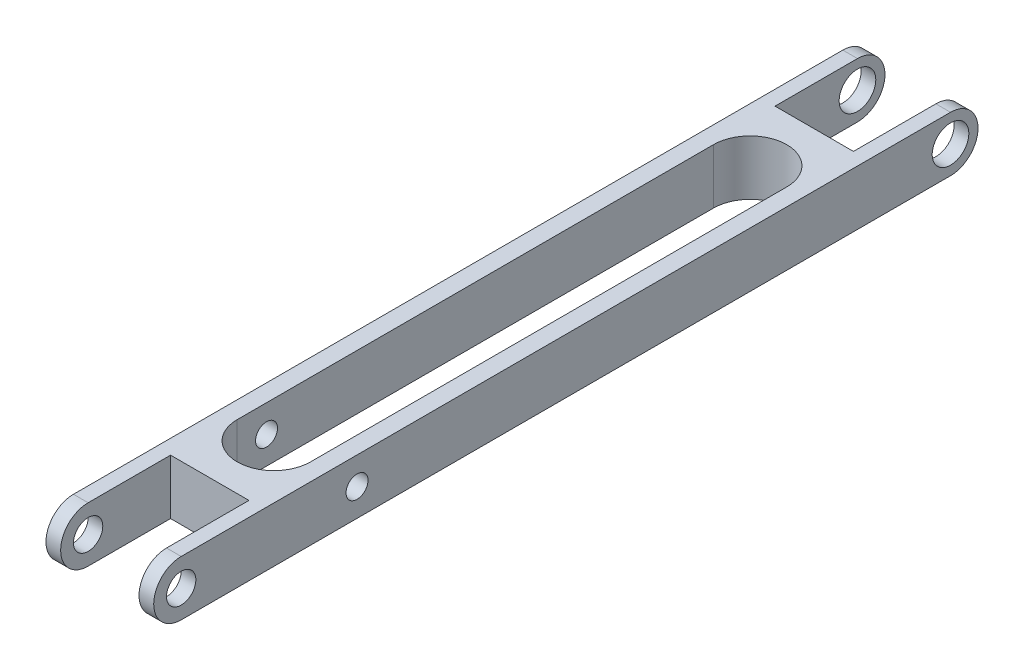
ISO-10303-21;
HEADER;
FILE_DESCRIPTION(('STEP AP214'),'2;1');
FILE_NAME('part.step','',(''),(''),'','','');
FILE_SCHEMA(('AUTOMOTIVE_DESIGN { 1 0 10303 214 1 1 1 1 }'));
ENDSEC;
DATA;
#1=APPLICATION_CONTEXT('core data for automotive mechanical design processes');
#2=APPLICATION_PROTOCOL_DEFINITION('international standard','automotive_design',2000,#1);
#3=PRODUCT_CONTEXT('',#1,'mechanical');
#4=PRODUCT('Part','Part','',(#3));
#5=PRODUCT_RELATED_PRODUCT_CATEGORY('part','',(#4));
#6=PRODUCT_DEFINITION_FORMATION('','',#4);
#7=PRODUCT_DEFINITION_CONTEXT('part definition',#1,'design');
#8=PRODUCT_DEFINITION('design','',#6,#7);
#9=PRODUCT_DEFINITION_SHAPE('','',#8);
#10=(LENGTH_UNIT() NAMED_UNIT(*) SI_UNIT(.MILLI.,.METRE.));
#11=(NAMED_UNIT(*) PLANE_ANGLE_UNIT() SI_UNIT($,.RADIAN.));
#12=(NAMED_UNIT(*) SI_UNIT($,.STERADIAN.) SOLID_ANGLE_UNIT());
#13=UNCERTAINTY_MEASURE_WITH_UNIT(LENGTH_MEASURE(1.E-05),#10,'distance_accuracy_value','');
#14=(GEOMETRIC_REPRESENTATION_CONTEXT(3) GLOBAL_UNCERTAINTY_ASSIGNED_CONTEXT((#13)) GLOBAL_UNIT_ASSIGNED_CONTEXT((#10,
#11,#12)) REPRESENTATION_CONTEXT('',''));
#15=CARTESIAN_POINT('',(0.,0.,0.));
#16=DIRECTION('',(0.,0.,1.));
#17=DIRECTION('',(1.,0.,0.));
#18=AXIS2_PLACEMENT_3D('',#15,#16,#17);
#19=CARTESIAN_POINT('',(29.4,0.,-105.));
#20=DIRECTION('',(-1.,0.,0.));
#21=DIRECTION('',(0.,0.,1.));
#22=AXIS2_PLACEMENT_3D('',#19,#20,#21);
#23=CYLINDRICAL_SURFACE('',#22,7.5);
#24=DIRECTION('',(-1.,0.,0.));
#25=VECTOR('',#24,1.);
#26=CARTESIAN_POINT('',(29.4,7.5,-105.));
#27=LINE('',#26,#25);
#28=CARTESIAN_POINT('',(4.,7.5,-105.));
#29=VERTEX_POINT('',#28);
#30=CARTESIAN_POINT('',(0.,7.5,-105.));
#31=VERTEX_POINT('',#30);
#32=EDGE_CURVE('E340',#29,#31,#27,.T.);
#33=ORIENTED_EDGE('',*,*,#32,.F.);
#34=CARTESIAN_POINT('',(4.,0.,-105.));
#35=DIRECTION('',(-1.,0.,0.));
#36=DIRECTION('',(0.,0.,1.));
#37=AXIS2_PLACEMENT_3D('',#34,#35,#36);
#38=CIRCLE('',#37,7.5);
#39=CARTESIAN_POINT('',(4.,-7.5,-105.));
#40=VERTEX_POINT('',#39);
#41=EDGE_CURVE('E287',#29,#40,#38,.T.);
#42=ORIENTED_EDGE('',*,*,#41,.T.);
#43=DIRECTION('',(-1.,0.,0.));
#44=VECTOR('',#43,1.);
#45=CARTESIAN_POINT('',(29.4,-7.5,-105.));
#46=LINE('',#45,#44);
#47=CARTESIAN_POINT('',(0.,-7.5,-105.));
#48=VERTEX_POINT('',#47);
#49=EDGE_CURVE('E311',#40,#48,#46,.T.);
#50=ORIENTED_EDGE('',*,*,#49,.T.);
#51=CARTESIAN_POINT('',(0.,0.,-105.));
#52=DIRECTION('',(1.,0.,0.));
#53=DIRECTION('',(0.,0.,1.));
#54=AXIS2_PLACEMENT_3D('',#51,#52,#53);
#55=CIRCLE('',#54,7.5);
#56=EDGE_CURVE('E296',#48,#31,#55,.T.);
#57=ORIENTED_EDGE('',*,*,#56,.T.);
#58=EDGE_LOOP('',(#33,#42,#50,#57));
#59=FACE_BOUND('',#58,.T.);
#60=ADVANCED_FACE('F39',(#59),#23,.T.);
#61=CARTESIAN_POINT('',(29.4,0.,105.));
#62=DIRECTION('',(-1.,0.,0.));
#63=DIRECTION('',(0.,0.,1.));
#64=AXIS2_PLACEMENT_3D('',#61,#62,#63);
#65=CYLINDRICAL_SURFACE('',#64,7.5);
#66=DIRECTION('',(-1.,0.,0.));
#67=VECTOR('',#66,1.);
#68=CARTESIAN_POINT('',(29.4,7.5,105.));
#69=LINE('',#68,#67);
#70=CARTESIAN_POINT('',(29.4,7.5,105.));
#71=VERTEX_POINT('',#70);
#72=CARTESIAN_POINT('',(25.4,7.5,105.));
#73=VERTEX_POINT('',#72);
#74=EDGE_CURVE('E336',#71,#73,#69,.T.);
#75=ORIENTED_EDGE('',*,*,#74,.T.);
#76=CARTESIAN_POINT('',(25.4,0.,105.));
#77=DIRECTION('',(1.,0.,0.));
#78=DIRECTION('',(0.,0.,-1.));
#79=AXIS2_PLACEMENT_3D('',#76,#77,#78);
#80=CIRCLE('',#79,7.5);
#81=CARTESIAN_POINT('',(25.4,-7.5,105.));
#82=VERTEX_POINT('',#81);
#83=EDGE_CURVE('E293',#73,#82,#80,.T.);
#84=ORIENTED_EDGE('',*,*,#83,.T.);
#85=DIRECTION('',(-1.,0.,0.));
#86=VECTOR('',#85,1.);
#87=CARTESIAN_POINT('',(29.4,-7.5,105.));
#88=LINE('',#87,#86);
#89=CARTESIAN_POINT('',(29.4,-7.5,105.));
#90=VERTEX_POINT('',#89);
#91=EDGE_CURVE('E331',#90,#82,#88,.T.);
#92=ORIENTED_EDGE('',*,*,#91,.F.);
#93=CARTESIAN_POINT('',(29.4,0.,105.));
#94=DIRECTION('',(1.,0.,0.));
#95=DIRECTION('',(0.,0.,-1.));
#96=AXIS2_PLACEMENT_3D('',#93,#94,#95);
#97=CIRCLE('',#96,7.5);
#98=EDGE_CURVE('E305',#71,#90,#97,.T.);
#99=ORIENTED_EDGE('',*,*,#98,.F.);
#100=EDGE_LOOP('',(#75,#84,#92,#99));
#101=FACE_BOUND('',#100,.T.);
#102=ADVANCED_FACE('F373',(#101),#65,.T.);
#103=CARTESIAN_POINT('',(25.4,0.,-105.));
#104=DIRECTION('',(1.,0.,0.));
#105=DIRECTION('',(0.,0.,-1.));
#106=AXIS2_PLACEMENT_3D('',#103,#104,#105);
#107=CIRCLE('',#106,7.5);
#108=CARTESIAN_POINT('',(25.4,-7.5,-105.));
#109=VERTEX_POINT('',#108);
#110=CARTESIAN_POINT('',(25.4,7.5,-105.));
#111=VERTEX_POINT('',#110);
#112=EDGE_CURVE('E257',#109,#111,#107,.T.);
#113=ORIENTED_EDGE('',*,*,#112,.T.);
#114=CARTESIAN_POINT('',(29.4,7.5,-105.));
#115=VERTEX_POINT('',#114);
#116=EDGE_CURVE('E341',#115,#111,#27,.T.);
#117=ORIENTED_EDGE('',*,*,#116,.F.);
#118=CARTESIAN_POINT('',(29.4,0.,-105.));
#119=DIRECTION('',(1.,0.,0.));
#120=DIRECTION('',(0.,0.,1.));
#121=AXIS2_PLACEMENT_3D('',#118,#119,#120);
#122=CIRCLE('',#121,7.5);
#123=CARTESIAN_POINT('',(29.4,-7.5,-105.));
#124=VERTEX_POINT('',#123);
#125=EDGE_CURVE('E297',#124,#115,#122,.T.);
#126=ORIENTED_EDGE('',*,*,#125,.F.);
#127=EDGE_CURVE('E326',#124,#109,#46,.T.);
#128=ORIENTED_EDGE('',*,*,#127,.T.);
#129=EDGE_LOOP('',(#113,#117,#126,#128));
#130=FACE_BOUND('',#129,.T.);
#131=ADVANCED_FACE('F41',(#130),#23,.T.);
#132=CARTESIAN_POINT('',(29.4,7.5,105.));
#133=DIRECTION('',(0.,-1.,0.));
#134=DIRECTION('',(0.,0.,-1.));
#135=AXIS2_PLACEMENT_3D('',#132,#133,#134);
#136=PLANE('',#135);
#137=DIRECTION('',(0.,0.,1.));
#138=VECTOR('',#137,1.);
#139=CARTESIAN_POINT('',(24.7,7.5,65.));
#140=LINE('',#139,#138);
#141=CARTESIAN_POINT('',(24.7,7.5,-65.));
#142=VERTEX_POINT('',#141);
#143=CARTESIAN_POINT('',(24.7,7.5,65.));
#144=VERTEX_POINT('',#143);
#145=EDGE_CURVE('E164',#142,#144,#140,.T.);
#146=ORIENTED_EDGE('',*,*,#145,.T.);
#147=CARTESIAN_POINT('',(14.7,7.5,65.));
#148=DIRECTION('',(0.,-1.,0.));
#149=DIRECTION('',(0.,0.,-1.));
#150=AXIS2_PLACEMENT_3D('',#147,#148,#149);
#151=CIRCLE('',#150,10.);
#152=CARTESIAN_POINT('',(4.69999999999998,7.5,65.));
#153=VERTEX_POINT('',#152);
#154=EDGE_CURVE('E157',#144,#153,#151,.T.);
#155=ORIENTED_EDGE('',*,*,#154,.T.);
#156=DIRECTION('',(0.,0.,-1.));
#157=VECTOR('',#156,1.);
#158=CARTESIAN_POINT('',(4.69999999999998,7.5,65.));
#159=LINE('',#158,#157);
#160=CARTESIAN_POINT('',(4.70000000000002,7.5,-65.));
#161=VERTEX_POINT('',#160);
#162=EDGE_CURVE('E167',#153,#161,#159,.T.);
#163=ORIENTED_EDGE('',*,*,#162,.T.);
#164=CARTESIAN_POINT('',(14.7,7.5,-65.));
#165=DIRECTION('',(0.,-1.,0.));
#166=DIRECTION('',(0.,0.,-1.));
#167=AXIS2_PLACEMENT_3D('',#164,#165,#166);
#168=CIRCLE('',#167,10.);
#169=EDGE_CURVE('E57',#161,#142,#168,.T.);
#170=ORIENTED_EDGE('',*,*,#169,.T.);
#171=EDGE_LOOP('',(#146,#155,#163,#170));
#172=FACE_BOUND('',#171,.T.);
#173=DIRECTION('',(-1.,0.,0.));
#174=VECTOR('',#173,1.);
#175=CARTESIAN_POINT('',(4.,7.5,82.5));
#176=LINE('',#175,#174);
#177=CARTESIAN_POINT('',(25.4,7.5,82.5));
#178=VERTEX_POINT('',#177);
#179=CARTESIAN_POINT('',(4.,7.5,82.5));
#180=VERTEX_POINT('',#179);
#181=EDGE_CURVE('E246',#178,#180,#176,.T.);
#182=ORIENTED_EDGE('',*,*,#181,.F.);
#183=DIRECTION('',(0.,0.,-1.));
#184=VECTOR('',#183,1.);
#185=CARTESIAN_POINT('',(25.4,7.5,82.5));
#186=LINE('',#185,#184);
#187=EDGE_CURVE('E243',#73,#178,#186,.T.);
#188=ORIENTED_EDGE('',*,*,#187,.F.);
#189=ORIENTED_EDGE('',*,*,#74,.F.);
#190=DIRECTION('',(0.,0.,1.));
#191=VECTOR('',#190,1.);
#192=CARTESIAN_POINT('',(29.4,7.5,105.));
#193=LINE('',#192,#191);
#194=EDGE_CURVE('E301',#115,#71,#193,.T.);
#195=ORIENTED_EDGE('',*,*,#194,.F.);
#196=ORIENTED_EDGE('',*,*,#116,.T.);
#197=DIRECTION('',(0.,0.,-1.));
#198=VECTOR('',#197,1.);
#199=CARTESIAN_POINT('',(25.4,7.5,-82.5));
#200=LINE('',#199,#198);
#201=CARTESIAN_POINT('',(25.4,7.5,-82.5));
#202=VERTEX_POINT('',#201);
#203=EDGE_CURVE('E274',#202,#111,#200,.T.);
#204=ORIENTED_EDGE('',*,*,#203,.F.);
#205=DIRECTION('',(1.,0.,0.));
#206=VECTOR('',#205,1.);
#207=CARTESIAN_POINT('',(4.,7.5,-82.5));
#208=LINE('',#207,#206);
#209=CARTESIAN_POINT('',(4.,7.5,-82.5));
#210=VERTEX_POINT('',#209);
#211=EDGE_CURVE('E232',#210,#202,#208,.T.);
#212=ORIENTED_EDGE('',*,*,#211,.F.);
#213=DIRECTION('',(0.,0.,1.));
#214=VECTOR('',#213,1.);
#215=CARTESIAN_POINT('',(4.,7.5,-112.5));
#216=LINE('',#215,#214);
#217=EDGE_CURVE('E266',#29,#210,#216,.T.);
#218=ORIENTED_EDGE('',*,*,#217,.F.);
#219=ORIENTED_EDGE('',*,*,#32,.T.);
#220=DIRECTION('',(0.,0.,1.));
#221=VECTOR('',#220,1.);
#222=CARTESIAN_POINT('',(0.,7.5,105.));
#223=LINE('',#222,#221);
#224=CARTESIAN_POINT('',(0.,7.5,105.));
#225=VERTEX_POINT('',#224);
#226=EDGE_CURVE('E315',#31,#225,#223,.T.);
#227=ORIENTED_EDGE('',*,*,#226,.T.);
#228=CARTESIAN_POINT('',(4.,7.5,105.));
#229=VERTEX_POINT('',#228);
#230=EDGE_CURVE('E335',#229,#225,#69,.T.);
#231=ORIENTED_EDGE('',*,*,#230,.F.);
#232=DIRECTION('',(0.,0.,1.));
#233=VECTOR('',#232,1.);
#234=CARTESIAN_POINT('',(4.,7.5,112.5));
#235=LINE('',#234,#233);
#236=EDGE_CURVE('E238',#180,#229,#235,.T.);
#237=ORIENTED_EDGE('',*,*,#236,.F.);
#238=EDGE_LOOP('',(#182,#188,#189,#195,#196,#204,#212,#218,#219,#227,#231,#237));
#239=FACE_BOUND('',#238,.T.);
#240=ADVANCED_FACE('F172',(#172,#239),#136,.F.);
#241=CARTESIAN_POINT('',(4.,0.,105.));
#242=DIRECTION('',(-1.,0.,0.));
#243=DIRECTION('',(0.,0.,1.));
#244=AXIS2_PLACEMENT_3D('',#241,#242,#243);
#245=CIRCLE('',#244,7.5);
#246=CARTESIAN_POINT('',(4.,-7.5,105.));
#247=VERTEX_POINT('',#246);
#248=EDGE_CURVE('E290',#247,#229,#245,.T.);
#249=ORIENTED_EDGE('',*,*,#248,.T.);
#250=ORIENTED_EDGE('',*,*,#230,.T.);
#251=CARTESIAN_POINT('',(0.,0.,105.));
#252=DIRECTION('',(1.,0.,0.));
#253=DIRECTION('',(0.,0.,-1.));
#254=AXIS2_PLACEMENT_3D('',#251,#252,#253);
#255=CIRCLE('',#254,7.5);
#256=CARTESIAN_POINT('',(0.,-7.5,105.));
#257=VERTEX_POINT('',#256);
#258=EDGE_CURVE('E319',#225,#257,#255,.T.);
#259=ORIENTED_EDGE('',*,*,#258,.T.);
#260=EDGE_CURVE('E330',#247,#257,#88,.T.);
#261=ORIENTED_EDGE('',*,*,#260,.F.);
#262=EDGE_LOOP('',(#249,#250,#259,#261));
#263=FACE_BOUND('',#262,.T.);
#264=ADVANCED_FACE('F380',(#263),#65,.T.);
#265=CARTESIAN_POINT('',(29.4,-7.5,105.));
#266=DIRECTION('',(0.,1.,0.));
#267=DIRECTION('',(0.,0.,1.));
#268=AXIS2_PLACEMENT_3D('',#265,#266,#267);
#269=PLANE('',#268);
#270=DIRECTION('',(0.,0.,-1.));
#271=VECTOR('',#270,1.);
#272=CARTESIAN_POINT('',(4.69999999999998,-7.5,65.));
#273=LINE('',#272,#271);
#274=CARTESIAN_POINT('',(4.69999999999998,-7.5,65.));
#275=VERTEX_POINT('',#274);
#276=CARTESIAN_POINT('',(4.70000000000002,-7.5,-65.));
#277=VERTEX_POINT('',#276);
#278=EDGE_CURVE('E192',#275,#277,#273,.T.);
#279=ORIENTED_EDGE('',*,*,#278,.F.);
#280=CARTESIAN_POINT('',(14.7,-7.5,65.));
#281=DIRECTION('',(0.,-1.,0.));
#282=DIRECTION('',(0.,0.,-1.));
#283=AXIS2_PLACEMENT_3D('',#280,#281,#282);
#284=CIRCLE('',#283,10.);
#285=CARTESIAN_POINT('',(24.7,-7.5,65.));
#286=VERTEX_POINT('',#285);
#287=EDGE_CURVE('E65',#286,#275,#284,.T.);
#288=ORIENTED_EDGE('',*,*,#287,.F.);
#289=DIRECTION('',(0.,0.,1.));
#290=VECTOR('',#289,1.);
#291=CARTESIAN_POINT('',(24.7,-7.5,65.));
#292=LINE('',#291,#290);
#293=CARTESIAN_POINT('',(24.7,-7.5,-65.));
#294=VERTEX_POINT('',#293);
#295=EDGE_CURVE('E176',#294,#286,#292,.T.);
#296=ORIENTED_EDGE('',*,*,#295,.F.);
#297=CARTESIAN_POINT('',(14.7,-7.5,-65.));
#298=DIRECTION('',(0.,-1.,0.));
#299=DIRECTION('',(0.,0.,-1.));
#300=AXIS2_PLACEMENT_3D('',#297,#298,#299);
#301=CIRCLE('',#300,10.);
#302=EDGE_CURVE('E180',#277,#294,#301,.T.);
#303=ORIENTED_EDGE('',*,*,#302,.F.);
#304=EDGE_LOOP('',(#279,#288,#296,#303));
#305=FACE_BOUND('',#304,.T.);
#306=ORIENTED_EDGE('',*,*,#91,.T.);
#307=DIRECTION('',(0.,0.,-1.));
#308=VECTOR('',#307,1.);
#309=CARTESIAN_POINT('',(25.4,-7.5,105.));
#310=LINE('',#309,#308);
#311=CARTESIAN_POINT('',(25.4,-7.5,82.5));
#312=VERTEX_POINT('',#311);
#313=EDGE_CURVE('E11',#82,#312,#310,.T.);
#314=ORIENTED_EDGE('',*,*,#313,.T.);
#315=DIRECTION('',(-1.,0.,0.));
#316=VECTOR('',#315,1.);
#317=CARTESIAN_POINT('',(4.,-7.5,82.5));
#318=LINE('',#317,#316);
#319=CARTESIAN_POINT('',(4.,-7.5,82.5));
#320=VERTEX_POINT('',#319);
#321=EDGE_CURVE('E233',#312,#320,#318,.T.);
#322=ORIENTED_EDGE('',*,*,#321,.T.);
#323=DIRECTION('',(0.,0.,1.));
#324=VECTOR('',#323,1.);
#325=CARTESIAN_POINT('',(4.,-7.5,112.5));
#326=LINE('',#325,#324);
#327=EDGE_CURVE('E237',#320,#247,#326,.T.);
#328=ORIENTED_EDGE('',*,*,#327,.T.);
#329=ORIENTED_EDGE('',*,*,#260,.T.);
#330=DIRECTION('',(0.,0.,-1.));
#331=VECTOR('',#330,1.);
#332=CARTESIAN_POINT('',(0.,-7.5,105.));
#333=LINE('',#332,#331);
#334=EDGE_CURVE('E302',#257,#48,#333,.T.);
#335=ORIENTED_EDGE('',*,*,#334,.T.);
#336=ORIENTED_EDGE('',*,*,#49,.F.);
#337=DIRECTION('',(0.,0.,1.));
#338=VECTOR('',#337,1.);
#339=CARTESIAN_POINT('',(4.00000000000002,-7.5,105.));
#340=LINE('',#339,#338);
#341=CARTESIAN_POINT('',(4.,-7.5,-82.5));
#342=VERTEX_POINT('',#341);
#343=EDGE_CURVE('E49',#40,#342,#340,.T.);
#344=ORIENTED_EDGE('',*,*,#343,.T.);
#345=DIRECTION('',(1.,0.,0.));
#346=VECTOR('',#345,1.);
#347=CARTESIAN_POINT('',(4.,-7.5,-82.5));
#348=LINE('',#347,#346);
#349=CARTESIAN_POINT('',(25.4,-7.5,-82.5));
#350=VERTEX_POINT('',#349);
#351=EDGE_CURVE('E261',#342,#350,#348,.T.);
#352=ORIENTED_EDGE('',*,*,#351,.T.);
#353=DIRECTION('',(0.,0.,-1.));
#354=VECTOR('',#353,1.);
#355=CARTESIAN_POINT('',(25.4,-7.5,-82.5));
#356=LINE('',#355,#354);
#357=EDGE_CURVE('E265',#350,#109,#356,.T.);
#358=ORIENTED_EDGE('',*,*,#357,.T.);
#359=ORIENTED_EDGE('',*,*,#127,.F.);
#360=DIRECTION('',(0.,0.,-1.));
#361=VECTOR('',#360,1.);
#362=CARTESIAN_POINT('',(29.4,-7.5,105.));
#363=LINE('',#362,#361);
#364=EDGE_CURVE('E308',#90,#124,#363,.T.);
#365=ORIENTED_EDGE('',*,*,#364,.F.);
#366=EDGE_LOOP('',(#306,#314,#322,#328,#329,#335,#336,#344,#352,#358,#359,#365));
#367=FACE_BOUND('',#366,.T.);
#368=ADVANCED_FACE('F402',(#305,#367),#269,.F.);
#369=CARTESIAN_POINT('',(29.4,0.,-105.));
#370=DIRECTION('',(-1.,0.,0.));
#371=DIRECTION('',(0.,0.,1.));
#372=AXIS2_PLACEMENT_3D('',#369,#370,#371);
#373=PLANE('',#372);
#374=CARTESIAN_POINT('',(29.4,0.,57.));
#375=DIRECTION('',(-1.,0.,0.));
#376=DIRECTION('',(0.,0.,1.));
#377=AXIS2_PLACEMENT_3D('',#374,#375,#376);
#378=CIRCLE('',#377,3.);
#379=CARTESIAN_POINT('',(29.4,0.,60.));
#380=VERTEX_POINT('',#379);
#381=EDGE_CURVE('E612',#380,#380,#378,.T.);
#382=ORIENTED_EDGE('',*,*,#381,.T.);
#383=EDGE_LOOP('',(#382));
#384=FACE_BOUND('',#383,.T.);
#385=CARTESIAN_POINT('',(29.4,0.,105.));
#386=DIRECTION('',(1.,0.,0.));
#387=DIRECTION('',(0.,0.,-1.));
#388=AXIS2_PLACEMENT_3D('',#385,#386,#387);
#389=CIRCLE('',#388,4.00000000000001);
#390=CARTESIAN_POINT('',(29.4,0.,101.));
#391=VERTEX_POINT('',#390);
#392=EDGE_CURVE('E212',#391,#391,#389,.T.);
#393=ORIENTED_EDGE('',*,*,#392,.F.);
#394=EDGE_LOOP('',(#393));
#395=FACE_BOUND('',#394,.T.);
#396=CARTESIAN_POINT('',(29.4,0.,-105.));
#397=DIRECTION('',(1.,0.,0.));
#398=DIRECTION('',(0.,0.,-1.));
#399=AXIS2_PLACEMENT_3D('',#396,#397,#398);
#400=CIRCLE('',#399,5.);
#401=CARTESIAN_POINT('',(29.4,0.,-110.));
#402=VERTEX_POINT('',#401);
#403=EDGE_CURVE('E201',#402,#402,#400,.T.);
#404=ORIENTED_EDGE('',*,*,#403,.F.);
#405=EDGE_LOOP('',(#404));
#406=FACE_BOUND('',#405,.T.);
#407=ORIENTED_EDGE('',*,*,#125,.T.);
#408=ORIENTED_EDGE('',*,*,#194,.T.);
#409=ORIENTED_EDGE('',*,*,#98,.T.);
#410=ORIENTED_EDGE('',*,*,#364,.T.);
#411=EDGE_LOOP('',(#407,#408,#409,#410));
#412=FACE_BOUND('',#411,.T.);
#413=ADVANCED_FACE('F398',(#384,#395,#406,#412),#373,.F.);
#414=CARTESIAN_POINT('',(0.,0.,-105.));
#415=DIRECTION('',(-1.,0.,0.));
#416=DIRECTION('',(0.,0.,1.));
#417=AXIS2_PLACEMENT_3D('',#414,#415,#416);
#418=PLANE('',#417);
#419=CARTESIAN_POINT('',(0.,0.,57.));
#420=DIRECTION('',(-1.,0.,0.));
#421=DIRECTION('',(0.,0.,1.));
#422=AXIS2_PLACEMENT_3D('',#419,#420,#421);
#423=CIRCLE('',#422,3.);
#424=CARTESIAN_POINT('',(0.,0.,60.));
#425=VERTEX_POINT('',#424);
#426=EDGE_CURVE('E620',#425,#425,#423,.T.);
#427=ORIENTED_EDGE('',*,*,#426,.F.);
#428=EDGE_LOOP('',(#427));
#429=FACE_BOUND('',#428,.T.);
#430=CARTESIAN_POINT('',(0.,0.,105.));
#431=DIRECTION('',(1.,0.,0.));
#432=DIRECTION('',(0.,0.,-1.));
#433=AXIS2_PLACEMENT_3D('',#430,#431,#432);
#434=CIRCLE('',#433,4.00000000000001);
#435=CARTESIAN_POINT('',(0.,0.,101.));
#436=VERTEX_POINT('',#435);
#437=EDGE_CURVE('E207',#436,#436,#434,.T.);
#438=ORIENTED_EDGE('',*,*,#437,.T.);
#439=EDGE_LOOP('',(#438));
#440=FACE_BOUND('',#439,.T.);
#441=CARTESIAN_POINT('',(0.,0.,-105.));
#442=DIRECTION('',(1.,0.,0.));
#443=DIRECTION('',(0.,0.,-1.));
#444=AXIS2_PLACEMENT_3D('',#441,#442,#443);
#445=CIRCLE('',#444,5.);
#446=CARTESIAN_POINT('',(0.,0.,-110.));
#447=VERTEX_POINT('',#446);
#448=EDGE_CURVE('E216',#447,#447,#445,.T.);
#449=ORIENTED_EDGE('',*,*,#448,.T.);
#450=EDGE_LOOP('',(#449));
#451=FACE_BOUND('',#450,.T.);
#452=ORIENTED_EDGE('',*,*,#56,.F.);
#453=ORIENTED_EDGE('',*,*,#334,.F.);
#454=ORIENTED_EDGE('',*,*,#258,.F.);
#455=ORIENTED_EDGE('',*,*,#226,.F.);
#456=EDGE_LOOP('',(#452,#453,#454,#455));
#457=FACE_BOUND('',#456,.T.);
#458=ADVANCED_FACE('F420',(#429,#440,#451,#457),#418,.T.);
#459=CARTESIAN_POINT('',(4.,-7.5,-112.5));
#460=DIRECTION('',(-1.,0.,0.));
#461=DIRECTION('',(0.,0.,1.));
#462=AXIS2_PLACEMENT_3D('',#459,#460,#461);
#463=PLANE('',#462);
#464=CARTESIAN_POINT('',(4.,0.,-105.));
#465=DIRECTION('',(-1.,0.,0.));
#466=DIRECTION('',(0.,0.,1.));
#467=AXIS2_PLACEMENT_3D('',#464,#465,#466);
#468=CIRCLE('',#467,5.);
#469=CARTESIAN_POINT('',(4.,0.,-100.));
#470=VERTEX_POINT('',#469);
#471=EDGE_CURVE('E228',#470,#470,#468,.T.);
#472=ORIENTED_EDGE('',*,*,#471,.T.);
#473=EDGE_LOOP('',(#472));
#474=FACE_BOUND('',#473,.T.);
#475=ORIENTED_EDGE('',*,*,#217,.T.);
#476=DIRECTION('',(0.,1.,0.));
#477=VECTOR('',#476,1.);
#478=CARTESIAN_POINT('',(4.,-7.5,-82.5));
#479=LINE('',#478,#477);
#480=EDGE_CURVE('E247',#342,#210,#479,.T.);
#481=ORIENTED_EDGE('',*,*,#480,.F.);
#482=ORIENTED_EDGE('',*,*,#343,.F.);
#483=ORIENTED_EDGE('',*,*,#41,.F.);
#484=EDGE_LOOP('',(#475,#481,#482,#483));
#485=FACE_BOUND('',#484,.T.);
#486=ADVANCED_FACE('F444',(#474,#485),#463,.F.);
#487=CARTESIAN_POINT('',(25.4,-7.5,-82.5));
#488=DIRECTION('',(1.,0.,0.));
#489=DIRECTION('',(0.,0.,-1.));
#490=AXIS2_PLACEMENT_3D('',#487,#488,#489);
#491=PLANE('',#490);
#492=CARTESIAN_POINT('',(25.4,0.,-105.));
#493=DIRECTION('',(1.,0.,0.));
#494=DIRECTION('',(0.,0.,-1.));
#495=AXIS2_PLACEMENT_3D('',#492,#493,#494);
#496=CIRCLE('',#495,5.);
#497=CARTESIAN_POINT('',(25.4,0.,-110.));
#498=VERTEX_POINT('',#497);
#499=EDGE_CURVE('E227',#498,#498,#496,.T.);
#500=ORIENTED_EDGE('',*,*,#499,.T.);
#501=EDGE_LOOP('',(#500));
#502=FACE_BOUND('',#501,.T.);
#503=ORIENTED_EDGE('',*,*,#112,.F.);
#504=ORIENTED_EDGE('',*,*,#357,.F.);
#505=DIRECTION('',(0.,1.,0.));
#506=VECTOR('',#505,1.);
#507=CARTESIAN_POINT('',(25.4,-7.5,-82.5));
#508=LINE('',#507,#506);
#509=EDGE_CURVE('E270',#350,#202,#508,.T.);
#510=ORIENTED_EDGE('',*,*,#509,.T.);
#511=ORIENTED_EDGE('',*,*,#203,.T.);
#512=EDGE_LOOP('',(#503,#504,#510,#511));
#513=FACE_BOUND('',#512,.T.);
#514=ADVANCED_FACE('F354',(#502,#513),#491,.F.);
#515=CARTESIAN_POINT('',(4.,-7.5,-82.5));
#516=DIRECTION('',(0.,0.,1.));
#517=DIRECTION('',(1.,0.,0.));
#518=AXIS2_PLACEMENT_3D('',#515,#516,#517);
#519=PLANE('',#518);
#520=ORIENTED_EDGE('',*,*,#211,.T.);
#521=ORIENTED_EDGE('',*,*,#509,.F.);
#522=ORIENTED_EDGE('',*,*,#351,.F.);
#523=ORIENTED_EDGE('',*,*,#480,.T.);
#524=EDGE_LOOP('',(#520,#521,#522,#523));
#525=FACE_BOUND('',#524,.T.);
#526=ADVANCED_FACE('F407',(#525),#519,.F.);
#527=CARTESIAN_POINT('',(25.4,-7.5,82.5));
#528=DIRECTION('',(1.,0.,0.));
#529=DIRECTION('',(0.,0.,-1.));
#530=AXIS2_PLACEMENT_3D('',#527,#528,#529);
#531=PLANE('',#530);
#532=CARTESIAN_POINT('',(25.4,0.,105.));
#533=DIRECTION('',(1.,0.,0.));
#534=DIRECTION('',(0.,0.,-1.));
#535=AXIS2_PLACEMENT_3D('',#532,#533,#534);
#536=CIRCLE('',#535,4.00000000000001);
#537=CARTESIAN_POINT('',(25.4,0.,101.));
#538=VERTEX_POINT('',#537);
#539=EDGE_CURVE('E223',#538,#538,#536,.T.);
#540=ORIENTED_EDGE('',*,*,#539,.T.);
#541=EDGE_LOOP('',(#540));
#542=FACE_BOUND('',#541,.T.);
#543=ORIENTED_EDGE('',*,*,#187,.T.);
#544=DIRECTION('',(0.,1.,0.));
#545=VECTOR('',#544,1.);
#546=CARTESIAN_POINT('',(25.4,-7.5,82.5));
#547=LINE('',#546,#545);
#548=EDGE_CURVE('E242',#312,#178,#547,.T.);
#549=ORIENTED_EDGE('',*,*,#548,.F.);
#550=ORIENTED_EDGE('',*,*,#313,.F.);
#551=ORIENTED_EDGE('',*,*,#83,.F.);
#552=EDGE_LOOP('',(#543,#549,#550,#551));
#553=FACE_BOUND('',#552,.T.);
#554=ADVANCED_FACE('F432',(#542,#553),#531,.F.);
#555=CARTESIAN_POINT('',(4.,-7.5,112.5));
#556=DIRECTION('',(-1.,0.,0.));
#557=DIRECTION('',(0.,0.,1.));
#558=AXIS2_PLACEMENT_3D('',#555,#556,#557);
#559=PLANE('',#558);
#560=CARTESIAN_POINT('',(4.,0.,105.));
#561=DIRECTION('',(-1.,0.,0.));
#562=DIRECTION('',(0.,0.,1.));
#563=AXIS2_PLACEMENT_3D('',#560,#561,#562);
#564=CIRCLE('',#563,4.00000000000001);
#565=CARTESIAN_POINT('',(4.,0.,109.));
#566=VERTEX_POINT('',#565);
#567=EDGE_CURVE('E211',#566,#566,#564,.T.);
#568=ORIENTED_EDGE('',*,*,#567,.T.);
#569=EDGE_LOOP('',(#568));
#570=FACE_BOUND('',#569,.T.);
#571=ORIENTED_EDGE('',*,*,#248,.F.);
#572=ORIENTED_EDGE('',*,*,#327,.F.);
#573=DIRECTION('',(0.,1.,0.));
#574=VECTOR('',#573,1.);
#575=CARTESIAN_POINT('',(4.,-7.5,82.5));
#576=LINE('',#575,#574);
#577=EDGE_CURVE('E254',#320,#180,#576,.T.);
#578=ORIENTED_EDGE('',*,*,#577,.T.);
#579=ORIENTED_EDGE('',*,*,#236,.T.);
#580=EDGE_LOOP('',(#571,#572,#578,#579));
#581=FACE_BOUND('',#580,.T.);
#582=ADVANCED_FACE('F425',(#570,#581),#559,.F.);
#583=CARTESIAN_POINT('',(4.,-7.5,82.5));
#584=DIRECTION('',(0.,0.,-1.));
#585=DIRECTION('',(-1.,0.,0.));
#586=AXIS2_PLACEMENT_3D('',#583,#584,#585);
#587=PLANE('',#586);
#588=ORIENTED_EDGE('',*,*,#181,.T.);
#589=ORIENTED_EDGE('',*,*,#577,.F.);
#590=ORIENTED_EDGE('',*,*,#321,.F.);
#591=ORIENTED_EDGE('',*,*,#548,.T.);
#592=EDGE_LOOP('',(#588,#589,#590,#591));
#593=FACE_BOUND('',#592,.T.);
#594=ADVANCED_FACE('F429',(#593),#587,.F.);
#595=CARTESIAN_POINT('',(0.,0.,105.));
#596=DIRECTION('',(1.,0.,0.));
#597=DIRECTION('',(0.,0.,-1.));
#598=AXIS2_PLACEMENT_3D('',#595,#596,#597);
#599=CYLINDRICAL_SURFACE('',#598,4.00000000000001);
#600=ORIENTED_EDGE('',*,*,#437,.F.);
#601=EDGE_LOOP('',(#600));
#602=FACE_BOUND('',#601,.T.);
#603=ORIENTED_EDGE('',*,*,#567,.F.);
#604=EDGE_LOOP('',(#603));
#605=FACE_BOUND('',#604,.T.);
#606=ADVANCED_FACE('F368',(#602,#605),#599,.F.);
#607=ORIENTED_EDGE('',*,*,#392,.T.);
#608=EDGE_LOOP('',(#607));
#609=FACE_BOUND('',#608,.T.);
#610=ORIENTED_EDGE('',*,*,#539,.F.);
#611=EDGE_LOOP('',(#610));
#612=FACE_BOUND('',#611,.T.);
#613=ADVANCED_FACE('F360',(#609,#612),#599,.F.);
#614=CARTESIAN_POINT('',(0.,0.,-105.));
#615=DIRECTION('',(1.,0.,0.));
#616=DIRECTION('',(0.,0.,-1.));
#617=AXIS2_PLACEMENT_3D('',#614,#615,#616);
#618=CYLINDRICAL_SURFACE('',#617,5.);
#619=ORIENTED_EDGE('',*,*,#403,.T.);
#620=EDGE_LOOP('',(#619));
#621=FACE_BOUND('',#620,.T.);
#622=ORIENTED_EDGE('',*,*,#499,.F.);
#623=EDGE_LOOP('',(#622));
#624=FACE_BOUND('',#623,.T.);
#625=ADVANCED_FACE('F357',(#621,#624),#618,.F.);
#626=ORIENTED_EDGE('',*,*,#448,.F.);
#627=EDGE_LOOP('',(#626));
#628=FACE_BOUND('',#627,.T.);
#629=ORIENTED_EDGE('',*,*,#471,.F.);
#630=EDGE_LOOP('',(#629));
#631=FACE_BOUND('',#630,.T.);
#632=ADVANCED_FACE('F359',(#628,#631),#618,.F.);
#633=CARTESIAN_POINT('',(14.7,7.5,65.));
#634=DIRECTION('',(0.,-1.,0.));
#635=DIRECTION('',(0.,0.,-1.));
#636=AXIS2_PLACEMENT_3D('',#633,#634,#635);
#637=CYLINDRICAL_SURFACE('',#636,10.);
#638=ORIENTED_EDGE('',*,*,#287,.T.);
#639=DIRECTION('',(0.,-1.,0.));
#640=VECTOR('',#639,1.);
#641=CARTESIAN_POINT('',(4.69999999999998,7.5,65.));
#642=LINE('',#641,#640);
#643=EDGE_CURVE('E153',#153,#275,#642,.T.);
#644=ORIENTED_EDGE('',*,*,#643,.F.);
#645=ORIENTED_EDGE('',*,*,#154,.F.);
#646=DIRECTION('',(0.,-1.,0.));
#647=VECTOR('',#646,1.);
#648=CARTESIAN_POINT('',(24.7,7.5,65.));
#649=LINE('',#648,#647);
#650=EDGE_CURVE('E198',#144,#286,#649,.T.);
#651=ORIENTED_EDGE('',*,*,#650,.T.);
#652=EDGE_LOOP('',(#638,#644,#645,#651));
#653=FACE_BOUND('',#652,.T.);
#654=ADVANCED_FACE('F155',(#653),#637,.F.);
#655=CARTESIAN_POINT('',(24.7,7.5,65.));
#656=DIRECTION('',(1.,0.,0.));
#657=DIRECTION('',(0.,0.,-1.));
#658=AXIS2_PLACEMENT_3D('',#655,#656,#657);
#659=PLANE('',#658);
#660=CARTESIAN_POINT('',(24.7,0.,57.));
#661=DIRECTION('',(1.,0.,0.));
#662=DIRECTION('',(0.,0.,-1.));
#663=AXIS2_PLACEMENT_3D('',#660,#661,#662);
#664=CIRCLE('',#663,3.);
#665=CARTESIAN_POINT('',(24.7,0.,54.));
#666=VERTEX_POINT('',#665);
#667=EDGE_CURVE('E183',#666,#666,#664,.T.);
#668=ORIENTED_EDGE('',*,*,#667,.T.);
#669=EDGE_LOOP('',(#668));
#670=FACE_BOUND('',#669,.T.);
#671=ORIENTED_EDGE('',*,*,#295,.T.);
#672=ORIENTED_EDGE('',*,*,#650,.F.);
#673=ORIENTED_EDGE('',*,*,#145,.F.);
#674=DIRECTION('',(0.,-1.,0.));
#675=VECTOR('',#674,1.);
#676=CARTESIAN_POINT('',(24.7,7.5,-65.));
#677=LINE('',#676,#675);
#678=EDGE_CURVE('E202',#142,#294,#677,.T.);
#679=ORIENTED_EDGE('',*,*,#678,.T.);
#680=EDGE_LOOP('',(#671,#672,#673,#679));
#681=FACE_BOUND('',#680,.T.);
#682=ADVANCED_FACE('F561',(#670,#681),#659,.F.);
#683=CARTESIAN_POINT('',(14.7,7.5,-65.));
#684=DIRECTION('',(0.,-1.,0.));
#685=DIRECTION('',(0.,0.,-1.));
#686=AXIS2_PLACEMENT_3D('',#683,#684,#685);
#687=CYLINDRICAL_SURFACE('',#686,10.);
#688=ORIENTED_EDGE('',*,*,#302,.T.);
#689=ORIENTED_EDGE('',*,*,#678,.F.);
#690=ORIENTED_EDGE('',*,*,#169,.F.);
#691=DIRECTION('',(0.,-1.,0.));
#692=VECTOR('',#691,1.);
#693=CARTESIAN_POINT('',(4.70000000000002,7.5,-65.));
#694=LINE('',#693,#692);
#695=EDGE_CURVE('E163',#161,#277,#694,.T.);
#696=ORIENTED_EDGE('',*,*,#695,.T.);
#697=EDGE_LOOP('',(#688,#689,#690,#696));
#698=FACE_BOUND('',#697,.T.);
#699=ADVANCED_FACE('F566',(#698),#687,.F.);
#700=CARTESIAN_POINT('',(4.69999999999998,7.5,65.));
#701=DIRECTION('',(-1.,0.,0.));
#702=DIRECTION('',(0.,0.,1.));
#703=AXIS2_PLACEMENT_3D('',#700,#701,#702);
#704=PLANE('',#703);
#705=CARTESIAN_POINT('',(4.69999999999998,0.,57.));
#706=DIRECTION('',(-1.,0.,0.));
#707=DIRECTION('',(0.,0.,1.));
#708=AXIS2_PLACEMENT_3D('',#705,#706,#707);
#709=CIRCLE('',#708,3.);
#710=CARTESIAN_POINT('',(4.69999999999998,0.,60.));
#711=VERTEX_POINT('',#710);
#712=EDGE_CURVE('E43',#711,#711,#709,.T.);
#713=ORIENTED_EDGE('',*,*,#712,.T.);
#714=EDGE_LOOP('',(#713));
#715=FACE_BOUND('',#714,.T.);
#716=ORIENTED_EDGE('',*,*,#278,.T.);
#717=ORIENTED_EDGE('',*,*,#695,.F.);
#718=ORIENTED_EDGE('',*,*,#162,.F.);
#719=ORIENTED_EDGE('',*,*,#643,.T.);
#720=EDGE_LOOP('',(#716,#717,#718,#719));
#721=FACE_BOUND('',#720,.T.);
#722=ADVANCED_FACE('F168',(#715,#721),#704,.F.);
#723=CARTESIAN_POINT('',(29.4,0.,57.));
#724=DIRECTION('',(-1.,0.,0.));
#725=DIRECTION('',(0.,0.,1.));
#726=AXIS2_PLACEMENT_3D('',#723,#724,#725);
#727=CYLINDRICAL_SURFACE('',#726,3.);
#728=ORIENTED_EDGE('',*,*,#426,.T.);
#729=EDGE_LOOP('',(#728));
#730=FACE_BOUND('',#729,.T.);
#731=ORIENTED_EDGE('',*,*,#712,.F.);
#732=EDGE_LOOP('',(#731));
#733=FACE_BOUND('',#732,.T.);
#734=ADVANCED_FACE('F579',(#730,#733),#727,.F.);
#735=ORIENTED_EDGE('',*,*,#381,.F.);
#736=EDGE_LOOP('',(#735));
#737=FACE_BOUND('',#736,.T.);
#738=ORIENTED_EDGE('',*,*,#667,.F.);
#739=EDGE_LOOP('',(#738));
#740=FACE_BOUND('',#739,.T.);
#741=ADVANCED_FACE('F587',(#737,#740),#727,.F.);
#742=CLOSED_SHELL('',(#60,#102,#131,#240,#264,#368,#413,#458,#486,#514,#526,#554,#582,#594,#606,
#613,#625,#632,#654,#682,#699,#722,#734,#741));
#743=MANIFOLD_SOLID_BREP('B2',#742);
#744=ADVANCED_BREP_SHAPE_REPRESENTATION('',(#18,#743),#14);
#745=SHAPE_DEFINITION_REPRESENTATION(#9,#744);
ENDSEC;
END-ISO-10303-21;
